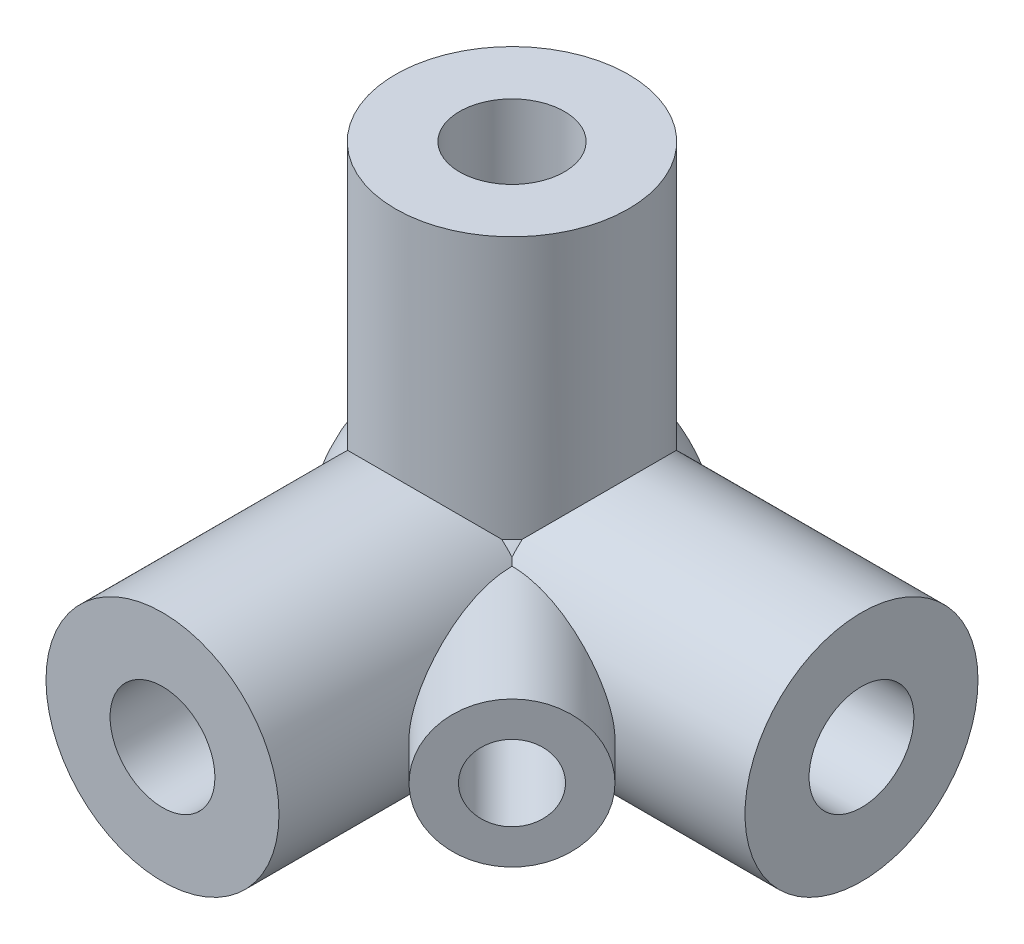
ISO-10303-21;
HEADER;
FILE_DESCRIPTION(('STEP AP214'),'2;1');
FILE_NAME('part.step','',(''),(''),'','','');
FILE_SCHEMA(('AUTOMOTIVE_DESIGN { 1 0 10303 214 1 1 1 1 }'));
ENDSEC;
DATA;
#1=APPLICATION_CONTEXT('core data for automotive mechanical design processes');
#2=APPLICATION_PROTOCOL_DEFINITION('international standard','automotive_design',2000,#1);
#3=PRODUCT_CONTEXT('',#1,'mechanical');
#4=PRODUCT('Part','Part','',(#3));
#5=PRODUCT_RELATED_PRODUCT_CATEGORY('part','',(#4));
#6=PRODUCT_DEFINITION_FORMATION('','',#4);
#7=PRODUCT_DEFINITION_CONTEXT('part definition',#1,'design');
#8=PRODUCT_DEFINITION('design','',#6,#7);
#9=PRODUCT_DEFINITION_SHAPE('','',#8);
#10=(LENGTH_UNIT() NAMED_UNIT(*) SI_UNIT(.MILLI.,.METRE.));
#11=(NAMED_UNIT(*) PLANE_ANGLE_UNIT() SI_UNIT($,.RADIAN.));
#12=(NAMED_UNIT(*) SI_UNIT($,.STERADIAN.) SOLID_ANGLE_UNIT());
#13=UNCERTAINTY_MEASURE_WITH_UNIT(LENGTH_MEASURE(1.E-05),#10,'distance_accuracy_value','');
#14=(GEOMETRIC_REPRESENTATION_CONTEXT(3) GLOBAL_UNCERTAINTY_ASSIGNED_CONTEXT((#13)) GLOBAL_UNIT_ASSIGNED_CONTEXT((#10,
#11,#12)) REPRESENTATION_CONTEXT('',''));
#15=CARTESIAN_POINT('',(0.,0.,0.));
#16=DIRECTION('',(0.,0.,1.));
#17=DIRECTION('',(1.,0.,0.));
#18=AXIS2_PLACEMENT_3D('',#15,#16,#17);
#19=CARTESIAN_POINT('',(0.,0.,6.));
#20=DIRECTION('',(0.,0.,-1.));
#21=DIRECTION('',(-1.,0.,0.));
#22=AXIS2_PLACEMENT_3D('',#19,#20,#21);
#23=CYLINDRICAL_SURFACE('',#22,2.);
#24=CARTESIAN_POINT('',(0.,0.,6.));
#25=DIRECTION('',(0.,0.,1.));
#26=DIRECTION('',(1.,0.,0.));
#27=AXIS2_PLACEMENT_3D('',#24,#25,#26);
#28=CIRCLE('',#27,2.);
#29=CARTESIAN_POINT('',(2.,0.,6.));
#30=VERTEX_POINT('',#29);
#31=EDGE_CURVE('E116',#30,#30,#28,.T.);
#32=ORIENTED_EDGE('',*,*,#31,.F.);
#33=EDGE_LOOP('',(#32));
#34=FACE_BOUND('',#33,.T.);
#35=CARTESIAN_POINT('',(1.56186217847897,1.24923437970499,1.5));
#36=CARTESIAN_POINT('',(1.5611797442041,1.25008452342325,1.53378285649206));
#37=CARTESIAN_POINT('',(1.5610781152692,1.25021354837339,1.56758343948011));
#38=CARTESIAN_POINT('',(1.56192955316301,1.24915099153598,1.63513489638752));
#39=CARTESIAN_POINT('',(1.56288209026868,1.24796007302535,1.6688857867473));
#40=CARTESIAN_POINT('',(1.56715402904663,1.24259809942501,1.76983042325355));
#41=CARTESIAN_POINT('',(1.57188558842899,1.23664063647917,1.83687391022013));
#42=CARTESIAN_POINT('',(1.58437476684644,1.22059776387783,1.97050777060617));
#43=CARTESIAN_POINT('',(1.59214810619375,1.21049089599582,2.03709393131227));
#44=CARTESIAN_POINT('',(1.61006890510793,1.18655024092551,2.16930810910981));
#45=CARTESIAN_POINT('',(1.62021806658292,1.17271378098155,2.2349354033489));
#46=CARTESIAN_POINT('',(1.64597894500963,1.13639805801066,2.38639153470703));
#47=CARTESIAN_POINT('',(1.66229019530604,1.11257264589018,2.47178035249437));
#48=CARTESIAN_POINT('',(1.69712385284011,1.05867981751383,2.64015344738043));
#49=CARTESIAN_POINT('',(1.71564747044566,1.02860897772733,2.72313637710205));
#50=CARTESIAN_POINT('',(1.75404483376953,0.961676258122756,2.8860720803056));
#51=CARTESIAN_POINT('',(1.7739193055834,0.924810707575262,2.96602318761048));
#52=CARTESIAN_POINT('',(1.81411969274755,0.84323231536684,3.1216253272983));
#53=CARTESIAN_POINT('',(1.83444484073104,0.798532033681707,3.19728298938423));
#54=CARTESIAN_POINT('',(1.87311872165659,0.702795248620061,3.33730451836777));
#55=CARTESIAN_POINT('',(1.89150792751245,0.652395352471204,3.40208644499782));
#56=CARTESIAN_POINT('',(1.92627614839675,0.54113928714998,3.52229557342339));
#57=CARTESIAN_POINT('',(1.94266983904766,0.480368493792379,3.57779235734296));
#58=CARTESIAN_POINT('',(1.96336572511513,0.382343076076153,3.6470414138494));
#59=CARTESIAN_POINT('',(1.9694296677475,0.350014578260387,3.66719413383687));
#60=CARTESIAN_POINT('',(1.98022128219707,0.282644393269188,3.70290784658708));
#61=CARTESIAN_POINT('',(1.98494889935578,0.24760259518876,3.71846865153204));
#62=CARTESIAN_POINT('',(1.99268289861949,0.174825311888379,3.74385961374976));
#63=CARTESIAN_POINT('',(1.99566979311688,0.137064455153827,3.7536249109961));
#64=CARTESIAN_POINT('',(1.99945847563277,0.0602934407687342,3.76600328863537));
#65=CARTESIAN_POINT('',(2.00026348143393,0.0212852087714209,3.76862690139063));
#66=CARTESIAN_POINT('',(1.99961930610182,-0.0521886112441087,3.76652459101473));
#67=CARTESIAN_POINT('',(1.99840857461239,-0.0866814434096832,3.762576119895));
#68=CARTESIAN_POINT('',(1.99431469468393,-0.154484267139775,3.74919222008702));
#69=CARTESIAN_POINT('',(1.99143002558648,-0.187793153933618,3.73975180231924));
#70=CARTESIAN_POINT('',(1.98315895905926,-0.262476782210571,3.71258340023276));
#71=CARTESIAN_POINT('',(1.97727638638829,-0.303188041780125,3.69320080850723));
#72=CARTESIAN_POINT('',(1.96379928548988,-0.380860624158611,3.64848582374093));
#73=CARTESIAN_POINT('',(1.95620136329501,-0.417814299110719,3.62314163093342));
#74=CARTESIAN_POINT('',(1.9346254703155,-0.51063252195997,3.55054403448781));
#75=CARTESIAN_POINT('',(1.91968291603739,-0.563408417047763,3.49967030716872));
#76=CARTESIAN_POINT('',(1.88837526209181,-0.660802722893515,3.3910189280803));
#77=CARTESIAN_POINT('',(1.8720054923549,-0.705392748455122,3.33321836052989));
#78=CARTESIAN_POINT('',(1.83934575626312,-0.786543718114268,3.21507797560066));
#79=CARTESIAN_POINT('',(1.82306955187426,-0.823313513982409,3.1548757106535));
#80=CARTESIAN_POINT('',(1.79067688618119,-0.891573269328804,3.03148158824448));
#81=CARTESIAN_POINT('',(1.77456056587237,-0.923058901497342,2.96828733435025));
#82=CARTESIAN_POINT('',(1.74294703652529,-0.981446352600213,2.83957383765412));
#83=CARTESIAN_POINT('',(1.72745069194186,-1.00834193105892,2.7740515736213));
#84=CARTESIAN_POINT('',(1.69753967310447,-1.05792063744095,2.64119455281979));
#85=CARTESIAN_POINT('',(1.68312507943618,-1.08060345171719,2.57385966152505));
#86=CARTESIAN_POINT('',(1.65331061421796,-1.12580039968265,2.42501334469343));
#87=CARTESIAN_POINT('',(1.63822471973388,-1.14750127310297,2.34319100709687));
#88=CARTESIAN_POINT('',(1.61115498885724,-1.1852077765324,2.17777706905975));
#89=CARTESIAN_POINT('',(1.59916880075581,-1.20121772764832,2.09418686227748));
#90=CARTESIAN_POINT('',(1.58442307181804,-1.22051946277406,1.96797136753591));
#91=CARTESIAN_POINT('',(1.58005478043994,-1.22615825434764,1.92588430856577));
#92=CARTESIAN_POINT('',(1.57255126985866,-1.23576682442251,1.84141663566469));
#93=CARTESIAN_POINT('',(1.56941574133223,-1.23973702162258,1.79903609809247));
#94=CARTESIAN_POINT('',(1.56456233855419,-1.24585775701644,1.71393699607687));
#95=CARTESIAN_POINT('',(1.56284843524639,-1.24800319864664,1.67121781905134));
#96=CARTESIAN_POINT('',(1.56106566771636,-1.25022831231673,1.58565724273998));
#97=CARTESIAN_POINT('',(1.5609982413159,-1.25030617880685,1.54281576930018));
#98=CARTESIAN_POINT('',(1.56186217847897,-1.24923437970499,1.5));
#99=B_SPLINE_CURVE_WITH_KNOTS('',3,(#35,#36,#37,#38,#39,#40,#41,#42,#43,#44,#45,#46,#47,#48,#49,
#50,#51,#52,#53,#54,#55,#56,#57,#58,#59,#60,#61,#62,#63,#64,#65,#66,#67,#68,#69,#70,#71,#72,#73,
#74,#75,#76,#77,#78,#79,#80,#81,#82,#83,#84,#85,#86,#87,#88,#89,#90,#91,#92,#93,#94,#95,#96,#97,
#98),.UNSPECIFIED.,.F.,.F.,(4,2,2,2,2,2,2,2,2,2,2,2,2,2,2,2,2,2,2,2,2,2,2,2,2,2,2,2,2,2,2,4),
(0.,0.101369274343976,0.202687633304006,0.404852827017127,0.608076936875439,0.811447073205138,
1.08157311888763,1.35184763114109,1.62226858496918,1.89225992316885,2.14391251403781,
2.39358541927441,2.50900538141634,2.62443006379316,2.74112327812023,2.85764430298627,
2.96133513151487,3.06512030389755,3.20077062458411,3.3366917306575,3.5598668455765,
3.78380179517204,4.00067506279687,4.21772507480947,4.43506786934249,4.6524268389155,
4.91014256435845,5.16766218661332,5.29568223772954,5.42367014568921,5.5520143623444,
5.68047065437365),.UNSPECIFIED.);
#100=CARTESIAN_POINT('',(1.5612494995996,1.25,1.5612494995996));
#101=VERTEX_POINT('',#100);
#102=CARTESIAN_POINT('',(1.5612494995996,-1.25,1.5612494995996));
#103=VERTEX_POINT('',#102);
#104=EDGE_CURVE('E139',#101,#103,#99,.T.);
#105=ORIENTED_EDGE('',*,*,#104,.F.);
#106=CARTESIAN_POINT('',(0.,0.,0.));
#107=DIRECTION('',(0.707106781186547,0.,-0.707106781186547));
#108=DIRECTION('',(-0.707106781186547,0.,-0.707106781186547));
#109=AXIS2_PLACEMENT_3D('',#106,#107,#108);
#110=ELLIPSE('',#109,2.82842712474619,2.);
#111=CARTESIAN_POINT('',(1.5,1.32287565553229,1.5));
#112=VERTEX_POINT('',#111);
#113=EDGE_CURVE('E122',#112,#101,#110,.T.);
#114=ORIENTED_EDGE('',*,*,#113,.F.);
#115=CARTESIAN_POINT('',(0.,0.,1.5));
#116=DIRECTION('',(0.,0.,-1.));
#117=DIRECTION('',(-1.,0.,0.));
#118=AXIS2_PLACEMENT_3D('',#115,#116,#117);
#119=CIRCLE('',#118,2.);
#120=CARTESIAN_POINT('',(1.32287565553229,1.5,1.5));
#121=VERTEX_POINT('',#120);
#122=EDGE_CURVE('E133',#112,#121,#119,.F.);
#123=ORIENTED_EDGE('',*,*,#122,.T.);
#124=CARTESIAN_POINT('',(0.,0.,0.));
#125=DIRECTION('',(0.,-0.707106781186547,0.707106781186547));
#126=DIRECTION('',(0.,-0.707106781186547,-0.707106781186547));
#127=AXIS2_PLACEMENT_3D('',#124,#125,#126);
#128=ELLIPSE('',#127,2.82842712474619,2.);
#129=CARTESIAN_POINT('',(-1.32287565553229,1.5,1.5));
#130=VERTEX_POINT('',#129);
#131=EDGE_CURVE('E113',#121,#130,#128,.T.);
#132=ORIENTED_EDGE('',*,*,#131,.T.);
#133=CARTESIAN_POINT('',(1.5,-1.32287565553229,1.5));
#134=VERTEX_POINT('',#133);
#135=EDGE_CURVE('E132',#130,#134,#119,.F.);
#136=ORIENTED_EDGE('',*,*,#135,.T.);
#137=EDGE_CURVE('E124',#103,#134,#110,.T.);
#138=ORIENTED_EDGE('',*,*,#137,.F.);
#139=EDGE_LOOP('',(#105,#114,#123,#132,#136,#138));
#140=FACE_BOUND('',#139,.T.);
#141=ADVANCED_FACE('F39',(#34,#140),#23,.T.);
#142=CARTESIAN_POINT('',(6.,0.,0.));
#143=DIRECTION('',(-1.,0.,0.));
#144=DIRECTION('',(0.,0.,1.));
#145=AXIS2_PLACEMENT_3D('',#142,#143,#144);
#146=CYLINDRICAL_SURFACE('',#145,2.);
#147=CARTESIAN_POINT('',(6.,0.,0.));
#148=DIRECTION('',(1.,0.,0.));
#149=DIRECTION('',(0.,0.,-1.));
#150=AXIS2_PLACEMENT_3D('',#147,#148,#149);
#151=CIRCLE('',#150,2.);
#152=CARTESIAN_POINT('',(6.,0.,-2.));
#153=VERTEX_POINT('',#152);
#154=EDGE_CURVE('E125',#153,#153,#151,.T.);
#155=ORIENTED_EDGE('',*,*,#154,.F.);
#156=EDGE_LOOP('',(#155));
#157=FACE_BOUND('',#156,.T.);
#158=CARTESIAN_POINT('',(1.5,-1.24923437970499,1.56186217847897));
#159=CARTESIAN_POINT('',(1.53378285649206,-1.25008452342325,1.5611797442041));
#160=CARTESIAN_POINT('',(1.56758343948011,-1.25021354837339,1.5610781152692));
#161=CARTESIAN_POINT('',(1.63513489638752,-1.24915099153598,1.56192955316301));
#162=CARTESIAN_POINT('',(1.6688857867473,-1.24796007302535,1.56288209026868));
#163=CARTESIAN_POINT('',(1.76983042325355,-1.24259809942501,1.56715402904663));
#164=CARTESIAN_POINT('',(1.83687391022013,-1.23664063647917,1.57188558842899));
#165=CARTESIAN_POINT('',(1.97050777060617,-1.22059776387783,1.58437476684644));
#166=CARTESIAN_POINT('',(2.03709393131226,-1.21049089599582,1.59214810619375));
#167=CARTESIAN_POINT('',(2.16930810910981,-1.18655024092551,1.61006890510792));
#168=CARTESIAN_POINT('',(2.2349354033489,-1.17271378098155,1.62021806658291));
#169=CARTESIAN_POINT('',(2.38639153470703,-1.13639805801066,1.64597894500963));
#170=CARTESIAN_POINT('',(2.47178035249437,-1.11257264589018,1.66229019530604));
#171=CARTESIAN_POINT('',(2.64015344738044,-1.05867981751384,1.69712385284011));
#172=CARTESIAN_POINT('',(2.72313637710205,-1.02860897772734,1.71564747044565));
#173=CARTESIAN_POINT('',(2.88607208030561,-0.96167625812276,1.75404483376953));
#174=CARTESIAN_POINT('',(2.96602318761049,-0.924810707575267,1.77391930558339));
#175=CARTESIAN_POINT('',(3.12162532729831,-0.843232315366844,1.81411969274755));
#176=CARTESIAN_POINT('',(3.19728298938424,-0.79853203368171,1.83444484073104));
#177=CARTESIAN_POINT('',(3.33730451836779,-0.702795248620064,1.87311872165659));
#178=CARTESIAN_POINT('',(3.40208644499784,-0.652395352471207,1.89150792751245));
#179=CARTESIAN_POINT('',(3.52229557342341,-0.541139287149982,1.92627614839675));
#180=CARTESIAN_POINT('',(3.57779235734298,-0.480368493792381,1.94266983904766));
#181=CARTESIAN_POINT('',(3.64704141384942,-0.382343076076154,1.96336572511513));
#182=CARTESIAN_POINT('',(3.66719413383689,-0.350014578260388,1.9694296677475));
#183=CARTESIAN_POINT('',(3.7029078465871,-0.28264439326919,1.98022128219707));
#184=CARTESIAN_POINT('',(3.71846865153206,-0.247602595188762,1.98494889935578));
#185=CARTESIAN_POINT('',(3.74385961374978,-0.174825311888382,1.99268289861949));
#186=CARTESIAN_POINT('',(3.75362491099612,-0.137064455153829,1.99566979311688));
#187=CARTESIAN_POINT('',(3.76600328863539,-0.0602934407687374,1.99945847563276));
#188=CARTESIAN_POINT('',(3.76862690139065,-0.0212852087714244,2.00026348143393));
#189=CARTESIAN_POINT('',(3.76652459101475,0.0521886112441048,1.99961930610182));
#190=CARTESIAN_POINT('',(3.76257611989502,0.0866814434096791,1.99840857461239));
#191=CARTESIAN_POINT('',(3.74919222008704,0.154484267139771,1.99431469468393));
#192=CARTESIAN_POINT('',(3.73975180231926,0.187793153933614,1.99143002558648));
#193=CARTESIAN_POINT('',(3.71258340023279,0.262476782210567,1.98315895905926));
#194=CARTESIAN_POINT('',(3.69320080850726,0.30318804178012,1.97727638638829));
#195=CARTESIAN_POINT('',(3.64848582374095,0.380860624158606,1.96379928548988));
#196=CARTESIAN_POINT('',(3.62314163093344,0.417814299110714,1.95620136329502));
#197=CARTESIAN_POINT('',(3.55054403448783,0.510632521959964,1.9346254703155));
#198=CARTESIAN_POINT('',(3.49967030716875,0.563408417047757,1.9196829160374));
#199=CARTESIAN_POINT('',(3.39101892808033,0.660802722893508,1.88837526209181));
#200=CARTESIAN_POINT('',(3.33321836052992,0.705392748455115,1.8720054923549));
#201=CARTESIAN_POINT('',(3.21507797560069,0.78654371811426,1.83934575626313));
#202=CARTESIAN_POINT('',(3.15487571065353,0.823313513982402,1.82306955187427));
#203=CARTESIAN_POINT('',(3.03148158824452,0.891573269328796,1.7906768861812));
#204=CARTESIAN_POINT('',(2.96828733435028,0.923058901497334,1.77456056587237));
#205=CARTESIAN_POINT('',(2.83957383765416,0.981446352600206,1.74294703652529));
#206=CARTESIAN_POINT('',(2.77405157362134,1.00834193105892,1.72745069194186));
#207=CARTESIAN_POINT('',(2.64119455281983,1.05792063744094,1.69753967310447));
#208=CARTESIAN_POINT('',(2.57385966152508,1.08060345171719,1.68312507943618));
#209=CARTESIAN_POINT('',(2.42501334469347,1.12580039968265,1.65331061421797));
#210=CARTESIAN_POINT('',(2.3431910070969,1.14750127310296,1.63822471973388));
#211=CARTESIAN_POINT('',(2.17777706905978,1.1852077765324,1.61115498885724));
#212=CARTESIAN_POINT('',(2.0941868622775,1.20121772764832,1.59916880075581));
#213=CARTESIAN_POINT('',(1.96797136753593,1.22051946277406,1.58442307181804));
#214=CARTESIAN_POINT('',(1.92588430856579,1.22615825434764,1.58005478043994));
#215=CARTESIAN_POINT('',(1.84141663566471,1.23576682442251,1.57255126985866));
#216=CARTESIAN_POINT('',(1.79903609809248,1.23973702162259,1.56941574133223));
#217=CARTESIAN_POINT('',(1.71393699607687,1.24585775701644,1.56456233855419));
#218=CARTESIAN_POINT('',(1.67121781905134,1.24800319864664,1.56284843524639));
#219=CARTESIAN_POINT('',(1.58565724273998,1.25022831231673,1.56106566771636));
#220=CARTESIAN_POINT('',(1.54281576930018,1.25030617880685,1.5609982413159));
#221=CARTESIAN_POINT('',(1.5,1.24923437970499,1.56186217847897));
#222=B_SPLINE_CURVE_WITH_KNOTS('',3,(#158,#159,#160,#161,#162,#163,#164,#165,#166,#167,#168,
#169,#170,#171,#172,#173,#174,#175,#176,#177,#178,#179,#180,#181,#182,#183,#184,#185,#186,#187,
#188,#189,#190,#191,#192,#193,#194,#195,#196,#197,#198,#199,#200,#201,#202,#203,#204,#205,#206,
#207,#208,#209,#210,#211,#212,#213,#214,#215,#216,#217,#218,#219,#220,#221),.UNSPECIFIED.,.F.,
.F.,(4,2,2,2,2,2,2,2,2,2,2,2,2,2,2,2,2,2,2,2,2,2,2,2,2,2,2,2,2,2,2,4),(0.,0.101369274343976,
0.202687633304005,0.404852827017126,0.608076936875437,0.811447073205135,1.08157311888763,
1.3518476311411,1.62226858496919,1.89225992316886,2.14391251403783,2.39358541927443,
2.50900538141636,2.62443006379318,2.74112327812025,2.85764430298629,2.96133513151488,
3.06512030389757,3.20077062458413,3.33669173065752,3.55986684557651,3.78380179517205,
4.00067506279688,4.21772507480948,4.4350678693425,4.6524268389155,4.91014256435846,
5.16766218661334,5.29568223772957,5.42367014568924,5.55201436234443,5.68047065437369),.UNSPECIFIED.);
#223=EDGE_CURVE('E54',#103,#101,#222,.T.);
#224=ORIENTED_EDGE('',*,*,#223,.F.);
#225=ORIENTED_EDGE('',*,*,#137,.T.);
#226=CARTESIAN_POINT('',(1.5,0.,0.));
#227=DIRECTION('',(-1.,0.,0.));
#228=DIRECTION('',(0.,0.,1.));
#229=AXIS2_PLACEMENT_3D('',#226,#227,#228);
#230=CIRCLE('',#229,2.);
#231=CARTESIAN_POINT('',(1.5,1.5,-1.32287565553229));
#232=VERTEX_POINT('',#231);
#233=EDGE_CURVE('E94',#134,#232,#230,.F.);
#234=ORIENTED_EDGE('',*,*,#233,.T.);
#235=CARTESIAN_POINT('',(0.,0.,0.));
#236=DIRECTION('',(0.707106781186547,-0.707106781186547,0.));
#237=DIRECTION('',(-0.707106781186547,-0.707106781186547,0.));
#238=AXIS2_PLACEMENT_3D('',#235,#236,#237);
#239=ELLIPSE('',#238,2.82842712474619,2.);
#240=CARTESIAN_POINT('',(1.5,1.5,1.32287565553229));
#241=VERTEX_POINT('',#240);
#242=EDGE_CURVE('E119',#232,#241,#239,.T.);
#243=ORIENTED_EDGE('',*,*,#242,.T.);
#244=EDGE_CURVE('E107',#241,#112,#230,.F.);
#245=ORIENTED_EDGE('',*,*,#244,.T.);
#246=ORIENTED_EDGE('',*,*,#113,.T.);
#247=EDGE_LOOP('',(#224,#225,#234,#243,#245,#246));
#248=FACE_BOUND('',#247,.T.);
#249=ADVANCED_FACE('F176',(#157,#248),#146,.T.);
#250=CARTESIAN_POINT('',(0.,1.,0.));
#251=DIRECTION('',(0.,1.,0.));
#252=DIRECTION('',(0.,0.,1.));
#253=AXIS2_PLACEMENT_3D('',#250,#251,#252);
#254=CYLINDRICAL_SURFACE('',#253,0.9);
#255=CARTESIAN_POINT('',(0.,6.,0.));
#256=DIRECTION('',(0.,1.,0.));
#257=DIRECTION('',(0.,0.,1.));
#258=AXIS2_PLACEMENT_3D('',#255,#256,#257);
#259=CIRCLE('',#258,0.9);
#260=CARTESIAN_POINT('',(0.,6.,0.9));
#261=VERTEX_POINT('',#260);
#262=EDGE_CURVE('E136',#261,#261,#259,.T.);
#263=ORIENTED_EDGE('',*,*,#262,.T.);
#264=EDGE_LOOP('',(#263));
#265=FACE_BOUND('',#264,.T.);
#266=CARTESIAN_POINT('',(-0.178548903903152,1.,0.882111267876668));
#267=CARTESIAN_POINT('',(-0.152811556187796,1.0108913387643,0.887314424084402));
#268=CARTESIAN_POINT('',(-0.126937460362517,1.02195822402054,0.891385331237156));
#269=CARTESIAN_POINT('',(-0.0749533703656683,1.04417090737602,0.897256638442728));
#270=CARTESIAN_POINT('',(-0.0488432814622253,1.05531673673756,0.899056081841455));
#271=CARTESIAN_POINT('',(0.0302333981089106,1.08865289163981,0.901045160955579));
#272=CARTESIAN_POINT('',(0.0834713295443286,1.11053136610242,0.897729188442175));
#273=CARTESIAN_POINT('',(0.189843167562125,1.15138413253854,0.881399593260651));
#274=CARTESIAN_POINT('',(0.242975934487526,1.17034722064336,0.868349633638973));
#275=CARTESIAN_POINT('',(0.347187035966555,1.20316779573496,0.832152599341241));
#276=CARTESIAN_POINT('',(0.398273473380121,1.21704766708734,0.809050797915411));
#277=CARTESIAN_POINT('',(0.489417079458835,1.23653535956992,0.756856911584145));
#278=CARTESIAN_POINT('',(0.53001858066405,1.24302715634004,0.729050406696105));
#279=CARTESIAN_POINT('',(0.6064204628012,1.25023232653806,0.666838667154383));
#280=CARTESIAN_POINT('',(0.642222828674533,1.25094809625067,0.632436175025098));
#281=CARTESIAN_POINT('',(0.702533503296432,1.24686451158964,0.564094003445391));
#282=CARTESIAN_POINT('',(0.727931360437314,1.24288730331056,0.530879537088502));
#283=CARTESIAN_POINT('',(0.773623860631614,1.231077545276,0.461759328930581));
#284=CARTESIAN_POINT('',(0.793919216557133,1.22324553452893,0.425853963986755));
#285=CARTESIAN_POINT('',(0.829537798028118,1.20412236243573,0.35157008487007));
#286=CARTESIAN_POINT('',(0.844746673175729,1.19276148380421,0.313155306670161));
#287=CARTESIAN_POINT('',(0.869629396329331,1.16741496320691,0.235401615020305));
#288=CARTESIAN_POINT('',(0.879298325213464,1.15342700314447,0.196061912457328));
#289=CARTESIAN_POINT('',(0.894343659352957,1.12132072141288,0.110913779445864));
#290=CARTESIAN_POINT('',(0.898806684993902,1.10289876268078,0.0650603462053569));
#291=CARTESIAN_POINT('',(0.900775795048443,1.06499532081365,-0.0262931622646846));
#292=CARTESIAN_POINT('',(0.898288971029159,1.04551493758031,-0.071793550218354));
#293=CARTESIAN_POINT('',(0.889669664221953,1.01742843458267,-0.137541654300784));
#294=CARTESIAN_POINT('',(0.886246981037003,1.00865645492283,-0.158097357028728));
#295=CARTESIAN_POINT('',(0.882111267876742,1.00000000000001,-0.17854890390317));
#296=B_SPLINE_CURVE_WITH_KNOTS('',3,(#266,#267,#268,#269,#270,#271,#272,#273,#274,#275,#276,
#277,#278,#279,#280,#281,#282,#283,#284,#285,#286,#287,#288,#289,#290,#291,#292,#293,#294,#295),
.UNSPECIFIED.,.F.,.F.,(4,2,2,2,2,2,2,2,2,2,2,2,2,2,4),(0.,0.0852269056358933,0.170489693638172,
0.342582617032631,0.515321198396381,0.687289694936675,0.835263488693321,0.983175889804555,
1.10859487364941,1.23399632541791,1.36205241087946,1.49022202653132,1.6385339251382,
1.78669454282492,1.85447471209106),.UNSPECIFIED.);
#297=CARTESIAN_POINT('',(-0.178548903903152,1.,0.882111267876668));
#298=VERTEX_POINT('',#297);
#299=CARTESIAN_POINT('',(0.882111267876667,1.,-0.178548903903155));
#300=VERTEX_POINT('',#299);
#301=EDGE_CURVE('E166',#298,#300,#296,.T.);
#302=ORIENTED_EDGE('',*,*,#301,.F.);
#303=CARTESIAN_POINT('',(0.,1.,0.));
#304=DIRECTION('',(0.,1.,0.));
#305=DIRECTION('',(0.,0.,1.));
#306=AXIS2_PLACEMENT_3D('',#303,#304,#305);
#307=CIRCLE('',#306,0.9);
#308=EDGE_CURVE('E105',#300,#298,#307,.T.);
#309=ORIENTED_EDGE('',*,*,#308,.F.);
#310=EDGE_LOOP('',(#302,#309));
#311=FACE_BOUND('',#310,.T.);
#312=ADVANCED_FACE('F172',(#265,#311),#254,.F.);
#313=CARTESIAN_POINT('',(0.,1.,0.));
#314=DIRECTION('',(0.,1.,0.));
#315=DIRECTION('',(0.,0.,1.));
#316=AXIS2_PLACEMENT_3D('',#313,#314,#315);
#317=PLANE('',#316);
#318=DIRECTION('',(0.707106781186546,0.,-0.707106781186549));
#319=VECTOR('',#318,1.);
#320=CARTESIAN_POINT('',(0.,1.,0.));
#321=LINE('',#320,#319);
#322=CARTESIAN_POINT('',(-0.53033008588991,1.,0.530330085889912));
#323=VERTEX_POINT('',#322);
#324=CARTESIAN_POINT('',(0.53033008588991,1.,-0.530330085889912));
#325=VERTEX_POINT('',#324);
#326=EDGE_CURVE('E90',#323,#325,#321,.T.);
#327=ORIENTED_EDGE('',*,*,#326,.T.);
#328=DIRECTION('',(-0.707106781186549,0.,-0.707106781186546));
#329=VECTOR('',#328,1.);
#330=CARTESIAN_POINT('',(4.06586399182265,1.,3.00520382004282));
#331=LINE('',#330,#329);
#332=EDGE_CURVE('E11',#325,#300,#331,.F.);
#333=ORIENTED_EDGE('',*,*,#332,.T.);
#334=ORIENTED_EDGE('',*,*,#308,.T.);
#335=DIRECTION('',(-0.707106781186549,0.,-0.707106781186546));
#336=VECTOR('',#335,1.);
#337=CARTESIAN_POINT('',(3.00520382004284,1.,4.06586399182264));
#338=LINE('',#337,#336);
#339=EDGE_CURVE('E47',#298,#323,#338,.T.);
#340=ORIENTED_EDGE('',*,*,#339,.T.);
#341=EDGE_LOOP('',(#327,#333,#334,#340));
#342=FACE_BOUND('',#341,.T.);
#343=ADVANCED_FACE('F103',(#342),#317,.T.);
#344=CARTESIAN_POINT('',(0.,0.,0.));
#345=DIRECTION('',(0.,0.,-1.));
#346=DIRECTION('',(1.,0.,0.));
#347=AXIS2_PLACEMENT_3D('',#344,#345,#346);
#348=SPHERICAL_SURFACE('',#347,2.5);
#349=CARTESIAN_POINT('',(0.,1.5,0.));
#350=DIRECTION('',(0.,-1.,0.));
#351=DIRECTION('',(0.,0.,-1.));
#352=AXIS2_PLACEMENT_3D('',#349,#350,#351);
#353=CIRCLE('',#352,2.);
#354=EDGE_CURVE('E128',#232,#130,#353,.F.);
#355=ORIENTED_EDGE('',*,*,#354,.F.);
#356=ORIENTED_EDGE('',*,*,#233,.F.);
#357=ORIENTED_EDGE('',*,*,#135,.F.);
#358=EDGE_LOOP('',(#355,#356,#357));
#359=FACE_BOUND('',#358,.T.);
#360=ADVANCED_FACE('F178',(#359),#348,.T.);
#361=CARTESIAN_POINT('',(0.,6.,0.));
#362=DIRECTION('',(0.,-1.,0.));
#363=DIRECTION('',(0.,0.,-1.));
#364=AXIS2_PLACEMENT_3D('',#361,#362,#363);
#365=CYLINDRICAL_SURFACE('',#364,2.);
#366=CARTESIAN_POINT('',(0.,6.,0.));
#367=DIRECTION('',(0.,1.,0.));
#368=DIRECTION('',(0.,0.,1.));
#369=AXIS2_PLACEMENT_3D('',#366,#367,#368);
#370=CIRCLE('',#369,2.);
#371=CARTESIAN_POINT('',(0.,6.,2.));
#372=VERTEX_POINT('',#371);
#373=EDGE_CURVE('E110',#372,#372,#370,.T.);
#374=ORIENTED_EDGE('',*,*,#373,.F.);
#375=EDGE_LOOP('',(#374));
#376=FACE_BOUND('',#375,.T.);
#377=ORIENTED_EDGE('',*,*,#131,.F.);
#378=EDGE_CURVE('E129',#121,#241,#353,.F.);
#379=ORIENTED_EDGE('',*,*,#378,.T.);
#380=ORIENTED_EDGE('',*,*,#242,.F.);
#381=ORIENTED_EDGE('',*,*,#354,.T.);
#382=EDGE_LOOP('',(#377,#379,#380,#381));
#383=FACE_BOUND('',#382,.T.);
#384=ADVANCED_FACE('F41',(#376,#383),#365,.T.);
#385=CARTESIAN_POINT('',(0.,6.,0.));
#386=DIRECTION('',(0.,1.,0.));
#387=DIRECTION('',(0.,0.,1.));
#388=AXIS2_PLACEMENT_3D('',#385,#386,#387);
#389=PLANE('',#388);
#390=ORIENTED_EDGE('',*,*,#262,.F.);
#391=EDGE_LOOP('',(#390));
#392=FACE_BOUND('',#391,.T.);
#393=ORIENTED_EDGE('',*,*,#373,.T.);
#394=EDGE_LOOP('',(#393));
#395=FACE_BOUND('',#394,.T.);
#396=ADVANCED_FACE('F191',(#392,#395),#389,.T.);
#397=CARTESIAN_POINT('',(0.,0.,6.));
#398=DIRECTION('',(0.,0.,1.));
#399=DIRECTION('',(1.,0.,0.));
#400=AXIS2_PLACEMENT_3D('',#397,#398,#399);
#401=PLANE('',#400);
#402=CARTESIAN_POINT('',(0.,0.,6.));
#403=DIRECTION('',(0.,0.,1.));
#404=DIRECTION('',(1.,0.,0.));
#405=AXIS2_PLACEMENT_3D('',#402,#403,#404);
#406=CIRCLE('',#405,0.9);
#407=CARTESIAN_POINT('',(0.9,0.,6.));
#408=VERTEX_POINT('',#407);
#409=EDGE_CURVE('E229',#408,#408,#406,.T.);
#410=ORIENTED_EDGE('',*,*,#409,.F.);
#411=EDGE_LOOP('',(#410));
#412=FACE_BOUND('',#411,.T.);
#413=ORIENTED_EDGE('',*,*,#31,.T.);
#414=EDGE_LOOP('',(#413));
#415=FACE_BOUND('',#414,.T.);
#416=ADVANCED_FACE('F185',(#412,#415),#401,.T.);
#417=CARTESIAN_POINT('',(6.,0.,0.));
#418=DIRECTION('',(1.,0.,0.));
#419=DIRECTION('',(0.,0.,-1.));
#420=AXIS2_PLACEMENT_3D('',#417,#418,#419);
#421=PLANE('',#420);
#422=CARTESIAN_POINT('',(6.,0.,0.));
#423=DIRECTION('',(1.,0.,0.));
#424=DIRECTION('',(0.,0.,-1.));
#425=AXIS2_PLACEMENT_3D('',#422,#423,#424);
#426=CIRCLE('',#425,0.9);
#427=CARTESIAN_POINT('',(6.,0.,-0.9));
#428=VERTEX_POINT('',#427);
#429=EDGE_CURVE('E223',#428,#428,#426,.T.);
#430=ORIENTED_EDGE('',*,*,#429,.F.);
#431=EDGE_LOOP('',(#430));
#432=FACE_BOUND('',#431,.T.);
#433=ORIENTED_EDGE('',*,*,#154,.T.);
#434=EDGE_LOOP('',(#433));
#435=FACE_BOUND('',#434,.T.);
#436=ADVANCED_FACE('F183',(#432,#435),#421,.T.);
#437=ORIENTED_EDGE('',*,*,#378,.F.);
#438=ORIENTED_EDGE('',*,*,#122,.F.);
#439=ORIENTED_EDGE('',*,*,#244,.F.);
#440=EDGE_LOOP('',(#437,#438,#439));
#441=FACE_BOUND('',#440,.T.);
#442=ADVANCED_FACE('F182',(#441),#348,.T.);
#443=CARTESIAN_POINT('',(0.,0.,0.));
#444=DIRECTION('',(0.707106781186549,0.,0.707106781186546));
#445=DIRECTION('',(0.707106781186546,0.,-0.707106781186549));
#446=AXIS2_PLACEMENT_3D('',#443,#444,#445);
#447=PLANE('',#446);
#448=ORIENTED_EDGE('',*,*,#326,.F.);
#449=CARTESIAN_POINT('',(0.,0.,0.));
#450=DIRECTION('',(0.707106781186549,0.,0.707106781186546));
#451=DIRECTION('',(0.707106781186546,0.,-0.707106781186549));
#452=AXIS2_PLACEMENT_3D('',#449,#450,#451);
#453=CIRCLE('',#452,1.25);
#454=EDGE_CURVE('E61',#325,#323,#453,.T.);
#455=ORIENTED_EDGE('',*,*,#454,.F.);
#456=EDGE_LOOP('',(#448,#455));
#457=FACE_BOUND('',#456,.T.);
#458=ADVANCED_FACE('F91',(#457),#447,.F.);
#459=CARTESIAN_POINT('',(3.53553390593274,0.,3.53553390593273));
#460=DIRECTION('',(-0.707106781186549,0.,-0.707106781186546));
#461=DIRECTION('',(-0.707106781186546,0.,0.707106781186549));
#462=AXIS2_PLACEMENT_3D('',#459,#460,#461);
#463=CYLINDRICAL_SURFACE('',#462,1.25);
#464=ORIENTED_EDGE('',*,*,#332,.F.);
#465=ORIENTED_EDGE('',*,*,#454,.T.);
#466=ORIENTED_EDGE('',*,*,#339,.F.);
#467=ORIENTED_EDGE('',*,*,#301,.T.);
#468=EDGE_LOOP('',(#464,#465,#466,#467));
#469=FACE_BOUND('',#468,.T.);
#470=ADVANCED_FACE('F97',(#469),#463,.T.);
#471=CARTESIAN_POINT('',(3.53553390593274,0.,3.53553390593273));
#472=DIRECTION('',(0.707106781186549,0.,0.707106781186546));
#473=DIRECTION('',(0.707106781186546,0.,-0.707106781186549));
#474=AXIS2_PLACEMENT_3D('',#471,#472,#473);
#475=CIRCLE('',#474,1.25);
#476=CARTESIAN_POINT('',(4.41941738241593,0.,2.65165042944954));
#477=VERTEX_POINT('',#476);
#478=EDGE_CURVE('E99',#477,#477,#475,.T.);
#479=ORIENTED_EDGE('',*,*,#478,.F.);
#480=EDGE_LOOP('',(#479));
#481=FACE_BOUND('',#480,.T.);
#482=ORIENTED_EDGE('',*,*,#223,.T.);
#483=ORIENTED_EDGE('',*,*,#104,.T.);
#484=EDGE_LOOP('',(#482,#483));
#485=FACE_BOUND('',#484,.T.);
#486=ADVANCED_FACE('F161',(#481,#485),#463,.T.);
#487=CARTESIAN_POINT('',(3.53553390593274,0.,3.53553390593273));
#488=DIRECTION('',(0.707106781186549,0.,0.707106781186546));
#489=DIRECTION('',(0.707106781186546,0.,-0.707106781186549));
#490=AXIS2_PLACEMENT_3D('',#487,#488,#489);
#491=PLANE('',#490);
#492=CARTESIAN_POINT('',(3.53553390593275,0.,3.53553390593273));
#493=DIRECTION('',(0.707106781186549,0.,0.707106781186546));
#494=DIRECTION('',(0.707106781186546,0.,-0.707106781186549));
#495=AXIS2_PLACEMENT_3D('',#492,#493,#494);
#496=CIRCLE('',#495,0.65);
#497=CARTESIAN_POINT('',(3.995153313704,0.,3.07591449816148));
#498=VERTEX_POINT('',#497);
#499=EDGE_CURVE('E235',#498,#498,#496,.T.);
#500=ORIENTED_EDGE('',*,*,#499,.F.);
#501=EDGE_LOOP('',(#500));
#502=FACE_BOUND('',#501,.T.);
#503=ORIENTED_EDGE('',*,*,#478,.T.);
#504=EDGE_LOOP('',(#503));
#505=FACE_BOUND('',#504,.T.);
#506=ADVANCED_FACE('F212',(#502,#505),#491,.T.);
#507=CARTESIAN_POINT('',(1.,0.,0.));
#508=DIRECTION('',(1.,0.,0.));
#509=DIRECTION('',(0.,0.,-1.));
#510=AXIS2_PLACEMENT_3D('',#507,#508,#509);
#511=CYLINDRICAL_SURFACE('',#510,0.9);
#512=CARTESIAN_POINT('',(1.,0.,0.));
#513=DIRECTION('',(1.,0.,0.));
#514=DIRECTION('',(0.,0.,-1.));
#515=AXIS2_PLACEMENT_3D('',#512,#513,#514);
#516=CIRCLE('',#515,0.9);
#517=CARTESIAN_POINT('',(1.,0.,-0.9));
#518=VERTEX_POINT('',#517);
#519=EDGE_CURVE('E100',#518,#518,#516,.T.);
#520=ORIENTED_EDGE('',*,*,#519,.F.);
#521=EDGE_LOOP('',(#520));
#522=FACE_BOUND('',#521,.T.);
#523=ORIENTED_EDGE('',*,*,#429,.T.);
#524=EDGE_LOOP('',(#523));
#525=FACE_BOUND('',#524,.T.);
#526=ADVANCED_FACE('F217',(#522,#525),#511,.F.);
#527=CARTESIAN_POINT('',(1.,0.,0.));
#528=DIRECTION('',(1.,0.,0.));
#529=DIRECTION('',(0.,0.,-1.));
#530=AXIS2_PLACEMENT_3D('',#527,#528,#529);
#531=PLANE('',#530);
#532=ORIENTED_EDGE('',*,*,#519,.T.);
#533=EDGE_LOOP('',(#532));
#534=FACE_BOUND('',#533,.T.);
#535=ADVANCED_FACE('F259',(#534),#531,.T.);
#536=CARTESIAN_POINT('',(0.,0.,1.));
#537=DIRECTION('',(0.,0.,1.));
#538=DIRECTION('',(1.,0.,0.));
#539=AXIS2_PLACEMENT_3D('',#536,#537,#538);
#540=CYLINDRICAL_SURFACE('',#539,0.9);
#541=CARTESIAN_POINT('',(0.,0.,1.));
#542=DIRECTION('',(0.,0.,1.));
#543=DIRECTION('',(1.,0.,0.));
#544=AXIS2_PLACEMENT_3D('',#541,#542,#543);
#545=CIRCLE('',#544,0.9);
#546=CARTESIAN_POINT('',(0.9,0.,1.));
#547=VERTEX_POINT('',#546);
#548=EDGE_CURVE('E226',#547,#547,#545,.T.);
#549=ORIENTED_EDGE('',*,*,#548,.F.);
#550=EDGE_LOOP('',(#549));
#551=FACE_BOUND('',#550,.T.);
#552=ORIENTED_EDGE('',*,*,#409,.T.);
#553=EDGE_LOOP('',(#552));
#554=FACE_BOUND('',#553,.T.);
#555=ADVANCED_FACE('F254',(#551,#554),#540,.F.);
#556=CARTESIAN_POINT('',(0.,0.,1.));
#557=DIRECTION('',(0.,0.,1.));
#558=DIRECTION('',(1.,0.,0.));
#559=AXIS2_PLACEMENT_3D('',#556,#557,#558);
#560=PLANE('',#559);
#561=ORIENTED_EDGE('',*,*,#548,.T.);
#562=EDGE_LOOP('',(#561));
#563=FACE_BOUND('',#562,.T.);
#564=ADVANCED_FACE('F246',(#563),#560,.T.);
#565=CARTESIAN_POINT('',(1.4142135623731,0.,1.41421356237309));
#566=DIRECTION('',(0.707106781186549,0.,0.707106781186546));
#567=DIRECTION('',(0.707106781186546,0.,-0.707106781186549));
#568=AXIS2_PLACEMENT_3D('',#565,#566,#567);
#569=CYLINDRICAL_SURFACE('',#568,0.65);
#570=CARTESIAN_POINT('',(1.4142135623731,0.,1.41421356237309));
#571=DIRECTION('',(0.707106781186549,0.,0.707106781186546));
#572=DIRECTION('',(0.707106781186546,0.,-0.707106781186549));
#573=AXIS2_PLACEMENT_3D('',#570,#571,#572);
#574=CIRCLE('',#573,0.65);
#575=CARTESIAN_POINT('',(1.87383297014435,0.,0.954594154601837));
#576=VERTEX_POINT('',#575);
#577=EDGE_CURVE('E232',#576,#576,#574,.T.);
#578=ORIENTED_EDGE('',*,*,#577,.F.);
#579=EDGE_LOOP('',(#578));
#580=FACE_BOUND('',#579,.T.);
#581=ORIENTED_EDGE('',*,*,#499,.T.);
#582=EDGE_LOOP('',(#581));
#583=FACE_BOUND('',#582,.T.);
#584=ADVANCED_FACE('F243',(#580,#583),#569,.F.);
#585=CARTESIAN_POINT('',(1.4142135623731,0.,1.41421356237309));
#586=DIRECTION('',(0.707106781186549,0.,0.707106781186546));
#587=DIRECTION('',(0.707106781186546,0.,-0.707106781186549));
#588=AXIS2_PLACEMENT_3D('',#585,#586,#587);
#589=PLANE('',#588);
#590=ORIENTED_EDGE('',*,*,#577,.T.);
#591=EDGE_LOOP('',(#590));
#592=FACE_BOUND('',#591,.T.);
#593=ADVANCED_FACE('F241',(#592),#589,.T.);
#594=CLOSED_SHELL('',(#141,#249,#312,#343,#360,#384,#396,#416,#436,#442,#458,#470,#486,#506,
#526,#535,#555,#564,#584,#593));
#595=MANIFOLD_SOLID_BREP('B2',#594);
#596=ADVANCED_BREP_SHAPE_REPRESENTATION('',(#18,#595),#14);
#597=SHAPE_DEFINITION_REPRESENTATION(#9,#596);
ENDSEC;
END-ISO-10303-21;
